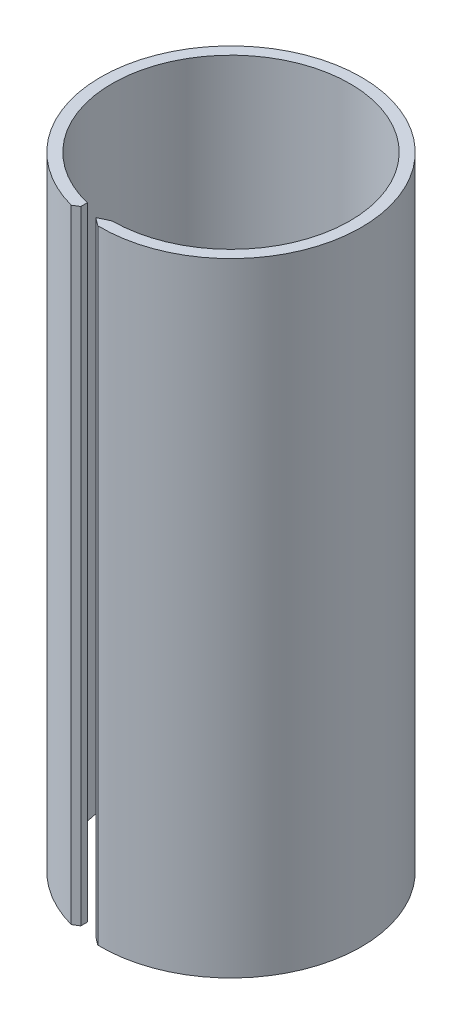
ISO-10303-21;
HEADER;
FILE_DESCRIPTION(('STEP AP214'),'2;1');
FILE_NAME('part.step','',(''),(''),'','','');
FILE_SCHEMA(('AUTOMOTIVE_DESIGN { 1 0 10303 214 1 1 1 1 }'));
ENDSEC;
DATA;
#1=APPLICATION_CONTEXT('core data for automotive mechanical design processes');
#2=APPLICATION_PROTOCOL_DEFINITION('international standard','automotive_design',2000,#1);
#3=PRODUCT_CONTEXT('',#1,'mechanical');
#4=PRODUCT('Part','Part','',(#3));
#5=PRODUCT_RELATED_PRODUCT_CATEGORY('part','',(#4));
#6=PRODUCT_DEFINITION_FORMATION('','',#4);
#7=PRODUCT_DEFINITION_CONTEXT('part definition',#1,'design');
#8=PRODUCT_DEFINITION('design','',#6,#7);
#9=PRODUCT_DEFINITION_SHAPE('','',#8);
#10=(LENGTH_UNIT() NAMED_UNIT(*) SI_UNIT(.MILLI.,.METRE.));
#11=(NAMED_UNIT(*) PLANE_ANGLE_UNIT() SI_UNIT($,.RADIAN.));
#12=(NAMED_UNIT(*) SI_UNIT($,.STERADIAN.) SOLID_ANGLE_UNIT());
#13=UNCERTAINTY_MEASURE_WITH_UNIT(LENGTH_MEASURE(1.E-05),#10,'distance_accuracy_value','');
#14=(GEOMETRIC_REPRESENTATION_CONTEXT(3) GLOBAL_UNCERTAINTY_ASSIGNED_CONTEXT((#13)) GLOBAL_UNIT_ASSIGNED_CONTEXT((#10,
#11,#12)) REPRESENTATION_CONTEXT('',''));
#15=CARTESIAN_POINT('',(0.,0.,0.));
#16=DIRECTION('',(0.,0.,1.));
#17=DIRECTION('',(1.,0.,0.));
#18=AXIS2_PLACEMENT_3D('',#15,#16,#17);
#19=CARTESIAN_POINT('',(-11.2330386189566,110.,14.934578177157));
#20=DIRECTION('',(0.601098948357001,0.,-0.799174608132733));
#21=DIRECTION('',(-0.799174608132733,0.,-0.601098948357001));
#22=AXIS2_PLACEMENT_3D('',#19,#20,#21);
#23=PLANE('',#22);
#24=DIRECTION('',(0.799174608132733,0.,0.601098948357001));
#25=VECTOR('',#24,1.);
#26=CARTESIAN_POINT('',(-11.2330386189566,0.,14.934578177157));
#27=LINE('',#26,#25);
#28=CARTESIAN_POINT('',(-1.93503191094466,0.,21.9280712100013));
#29=VERTEX_POINT('',#28);
#30=CARTESIAN_POINT('',(-0.517623396638923,0.,22.9941746105237));
#31=VERTEX_POINT('',#30);
#32=EDGE_CURVE('E118',#29,#31,#27,.T.);
#33=ORIENTED_EDGE('',*,*,#32,.T.);
#34=DIRECTION('',(0.,-1.,0.));
#35=VECTOR('',#34,1.);
#36=CARTESIAN_POINT('',(-0.517623396638923,110.,22.9941746105237));
#37=LINE('',#36,#35);
#38=CARTESIAN_POINT('',(-0.517623396638923,110.,22.9941746105237));
#39=VERTEX_POINT('',#38);
#40=EDGE_CURVE('E11',#39,#31,#37,.T.);
#41=ORIENTED_EDGE('',*,*,#40,.F.);
#42=DIRECTION('',(0.799174608132733,0.,0.601098948357001));
#43=VECTOR('',#42,1.);
#44=CARTESIAN_POINT('',(-11.2330386189566,110.,14.934578177157));
#45=LINE('',#44,#43);
#46=CARTESIAN_POINT('',(-1.93503191094466,110.,21.9280712100013));
#47=VERTEX_POINT('',#46);
#48=EDGE_CURVE('E131',#47,#39,#45,.T.);
#49=ORIENTED_EDGE('',*,*,#48,.F.);
#50=DIRECTION('',(0.,-1.,0.));
#51=VECTOR('',#50,1.);
#52=CARTESIAN_POINT('',(-1.93503191094466,110.,21.9280712100013));
#53=LINE('',#52,#51);
#54=EDGE_CURVE('E114',#47,#29,#53,.T.);
#55=ORIENTED_EDGE('',*,*,#54,.T.);
#56=EDGE_LOOP('',(#33,#41,#49,#55));
#57=FACE_BOUND('',#56,.T.);
#58=ADVANCED_FACE('F36',(#57),#23,.F.);
#59=CARTESIAN_POINT('',(0.,110.,0.));
#60=DIRECTION('',(0.,-1.,0.));
#61=DIRECTION('',(0.,0.,-1.));
#62=AXIS2_PLACEMENT_3D('',#59,#60,#61);
#63=CYLINDRICAL_SURFACE('',#62,23.);
#64=CARTESIAN_POINT('',(0.,0.,0.));
#65=DIRECTION('',(0.,1.,0.));
#66=DIRECTION('',(0.,0.,1.));
#67=AXIS2_PLACEMENT_3D('',#64,#65,#66);
#68=CIRCLE('',#67,23.);
#69=CARTESIAN_POINT('',(-6.01479470815307,0.,22.1996001004246));
#70=VERTEX_POINT('',#69);
#71=EDGE_CURVE('E121',#31,#70,#68,.T.);
#72=ORIENTED_EDGE('',*,*,#71,.T.);
#73=DIRECTION('',(0.,-1.,0.));
#74=VECTOR('',#73,1.);
#75=CARTESIAN_POINT('',(-6.01479470815307,110.,22.1996001004246));
#76=LINE('',#75,#74);
#77=CARTESIAN_POINT('',(-6.01479470815307,110.,22.1996001004246));
#78=VERTEX_POINT('',#77);
#79=EDGE_CURVE('E44',#78,#70,#76,.T.);
#80=ORIENTED_EDGE('',*,*,#79,.F.);
#81=CARTESIAN_POINT('',(0.,110.,0.));
#82=DIRECTION('',(0.,1.,0.));
#83=DIRECTION('',(0.,0.,1.));
#84=AXIS2_PLACEMENT_3D('',#81,#82,#83);
#85=CIRCLE('',#84,23.);
#86=EDGE_CURVE('E85',#39,#78,#85,.T.);
#87=ORIENTED_EDGE('',*,*,#86,.F.);
#88=ORIENTED_EDGE('',*,*,#40,.T.);
#89=EDGE_LOOP('',(#72,#80,#87,#88));
#90=FACE_BOUND('',#89,.T.);
#91=ADVANCED_FACE('F137',(#90),#63,.T.);
#92=CARTESIAN_POINT('',(8.26520913812445,110.,13.3753973063164));
#93=DIRECTION('',(0.525673997188739,0.,0.850686104670585));
#94=DIRECTION('',(0.850686104670585,0.,-0.525673997188739));
#95=AXIS2_PLACEMENT_3D('',#92,#93,#94);
#96=PLANE('',#95);
#97=DIRECTION('',(-0.850686104670585,0.,0.525673997188739));
#98=VECTOR('',#97,1.);
#99=CARTESIAN_POINT('',(8.26520913812445,0.,13.3753973063164));
#100=LINE('',#99,#98);
#101=CARTESIAN_POINT('',(-4.96678075902174,0.,21.5519890971125));
#102=VERTEX_POINT('',#101);
#103=EDGE_CURVE('E124',#102,#70,#100,.T.);
#104=ORIENTED_EDGE('',*,*,#103,.F.);
#105=DIRECTION('',(0.,-1.,0.));
#106=VECTOR('',#105,1.);
#107=CARTESIAN_POINT('',(-4.96678075902174,110.,21.5519890971125));
#108=LINE('',#107,#106);
#109=CARTESIAN_POINT('',(-4.96678075902174,110.,21.5519890971125));
#110=VERTEX_POINT('',#109);
#111=EDGE_CURVE('E104',#110,#102,#108,.T.);
#112=ORIENTED_EDGE('',*,*,#111,.F.);
#113=DIRECTION('',(-0.850686104670585,0.,0.525673997188739));
#114=VECTOR('',#113,1.);
#115=CARTESIAN_POINT('',(8.26520913812445,110.,13.3753973063164));
#116=LINE('',#115,#114);
#117=EDGE_CURVE('E110',#110,#78,#116,.T.);
#118=ORIENTED_EDGE('',*,*,#117,.T.);
#119=ORIENTED_EDGE('',*,*,#79,.T.);
#120=EDGE_LOOP('',(#104,#112,#118,#119));
#121=FACE_BOUND('',#120,.T.);
#122=ADVANCED_FACE('F136',(#121),#96,.T.);
#123=CARTESIAN_POINT('',(-4.96678075902174,110.,0.));
#124=DIRECTION('',(1.,0.,0.));
#125=DIRECTION('',(0.,0.,-1.));
#126=AXIS2_PLACEMENT_3D('',#123,#124,#125);
#127=PLANE('',#126);
#128=DIRECTION('',(0.,0.,1.));
#129=VECTOR('',#128,1.);
#130=CARTESIAN_POINT('',(-4.96678075902174,0.,0.));
#131=LINE('',#130,#129);
#132=CARTESIAN_POINT('',(-4.96678075902174,0.,20.4041929242941));
#133=VERTEX_POINT('',#132);
#134=EDGE_CURVE('E99',#133,#102,#131,.T.);
#135=ORIENTED_EDGE('',*,*,#134,.F.);
#136=DIRECTION('',(0.,-1.,0.));
#137=VECTOR('',#136,1.);
#138=CARTESIAN_POINT('',(-4.96678075902174,110.,20.4041929242941));
#139=LINE('',#138,#137);
#140=CARTESIAN_POINT('',(-4.96678075902174,110.,20.4041929242941));
#141=VERTEX_POINT('',#140);
#142=EDGE_CURVE('E94',#141,#133,#139,.T.);
#143=ORIENTED_EDGE('',*,*,#142,.F.);
#144=DIRECTION('',(0.,0.,1.));
#145=VECTOR('',#144,1.);
#146=CARTESIAN_POINT('',(-4.96678075902174,110.,0.));
#147=LINE('',#146,#145);
#148=EDGE_CURVE('E97',#141,#110,#147,.T.);
#149=ORIENTED_EDGE('',*,*,#148,.T.);
#150=ORIENTED_EDGE('',*,*,#111,.T.);
#151=EDGE_LOOP('',(#135,#143,#149,#150));
#152=FACE_BOUND('',#151,.T.);
#153=ADVANCED_FACE('F96',(#152),#127,.T.);
#154=CARTESIAN_POINT('',(0.,110.,0.));
#155=DIRECTION('',(0.,-1.,0.));
#156=DIRECTION('',(0.,0.,-1.));
#157=AXIS2_PLACEMENT_3D('',#154,#155,#156);
#158=CYLINDRICAL_SURFACE('',#157,21.);
#159=CARTESIAN_POINT('',(0.,0.,0.));
#160=DIRECTION('',(0.,1.,0.));
#161=DIRECTION('',(0.,0.,1.));
#162=AXIS2_PLACEMENT_3D('',#159,#160,#161);
#163=CIRCLE('',#162,21.);
#164=CARTESIAN_POINT('',(0.,0.,21.));
#165=VERTEX_POINT('',#164);
#166=EDGE_CURVE('E128',#165,#133,#163,.T.);
#167=ORIENTED_EDGE('',*,*,#166,.F.);
#168=DIRECTION('',(0.,-1.,0.));
#169=VECTOR('',#168,1.);
#170=CARTESIAN_POINT('',(0.,110.,21.));
#171=LINE('',#170,#169);
#172=CARTESIAN_POINT('',(0.,110.,21.));
#173=VERTEX_POINT('',#172);
#174=EDGE_CURVE('E74',#173,#165,#171,.T.);
#175=ORIENTED_EDGE('',*,*,#174,.F.);
#176=CARTESIAN_POINT('',(0.,110.,0.));
#177=DIRECTION('',(0.,1.,0.));
#178=DIRECTION('',(0.,0.,1.));
#179=AXIS2_PLACEMENT_3D('',#176,#177,#178);
#180=CIRCLE('',#179,21.);
#181=EDGE_CURVE('E108',#173,#141,#180,.T.);
#182=ORIENTED_EDGE('',*,*,#181,.T.);
#183=ORIENTED_EDGE('',*,*,#142,.T.);
#184=EDGE_LOOP('',(#167,#175,#182,#183));
#185=FACE_BOUND('',#184,.T.);
#186=ADVANCED_FACE('F112',(#185),#158,.F.);
#187=CARTESIAN_POINT('',(8.18835027550521,110.,17.072740658632));
#188=DIRECTION('',(0.432449245101612,0.,0.901658278069384));
#189=DIRECTION('',(0.901658278069384,0.,-0.432449245101612));
#190=AXIS2_PLACEMENT_3D('',#187,#188,#189);
#191=PLANE('',#190);
#192=DIRECTION('',(-0.901658278069384,0.,0.432449245101612));
#193=VECTOR('',#192,1.);
#194=CARTESIAN_POINT('',(8.18835027550521,0.,17.072740658632));
#195=LINE('',#194,#193);
#196=EDGE_CURVE('E77',#165,#29,#195,.T.);
#197=ORIENTED_EDGE('',*,*,#196,.T.);
#198=ORIENTED_EDGE('',*,*,#54,.F.);
#199=DIRECTION('',(-0.901658278069384,0.,0.432449245101612));
#200=VECTOR('',#199,1.);
#201=CARTESIAN_POINT('',(8.18835027550521,110.,17.072740658632));
#202=LINE('',#201,#200);
#203=EDGE_CURVE('E52',#173,#47,#202,.T.);
#204=ORIENTED_EDGE('',*,*,#203,.F.);
#205=ORIENTED_EDGE('',*,*,#174,.T.);
#206=EDGE_LOOP('',(#197,#198,#204,#205));
#207=FACE_BOUND('',#206,.T.);
#208=ADVANCED_FACE('F144',(#207),#191,.F.);
#209=CARTESIAN_POINT('',(0.,110.,0.));
#210=DIRECTION('',(0.,1.,0.));
#211=DIRECTION('',(0.,0.,1.));
#212=AXIS2_PLACEMENT_3D('',#209,#210,#211);
#213=PLANE('',#212);
#214=ORIENTED_EDGE('',*,*,#48,.T.);
#215=ORIENTED_EDGE('',*,*,#86,.T.);
#216=ORIENTED_EDGE('',*,*,#117,.F.);
#217=ORIENTED_EDGE('',*,*,#148,.F.);
#218=ORIENTED_EDGE('',*,*,#181,.F.);
#219=ORIENTED_EDGE('',*,*,#203,.T.);
#220=EDGE_LOOP('',(#214,#215,#216,#217,#218,#219));
#221=FACE_BOUND('',#220,.T.);
#222=ADVANCED_FACE('F107',(#221),#213,.T.);
#223=CARTESIAN_POINT('',(0.,0.,0.));
#224=DIRECTION('',(0.,1.,0.));
#225=DIRECTION('',(0.,0.,1.));
#226=AXIS2_PLACEMENT_3D('',#223,#224,#225);
#227=PLANE('',#226);
#228=ORIENTED_EDGE('',*,*,#32,.F.);
#229=ORIENTED_EDGE('',*,*,#196,.F.);
#230=ORIENTED_EDGE('',*,*,#166,.T.);
#231=ORIENTED_EDGE('',*,*,#134,.T.);
#232=ORIENTED_EDGE('',*,*,#103,.T.);
#233=ORIENTED_EDGE('',*,*,#71,.F.);
#234=EDGE_LOOP('',(#228,#229,#230,#231,#232,#233));
#235=FACE_BOUND('',#234,.T.);
#236=ADVANCED_FACE('F141',(#235),#227,.F.);
#237=CLOSED_SHELL('',(#58,#91,#122,#153,#186,#208,#222,#236));
#238=MANIFOLD_SOLID_BREP('B2',#237);
#239=ADVANCED_BREP_SHAPE_REPRESENTATION('',(#18,#238),#14);
#240=SHAPE_DEFINITION_REPRESENTATION(#9,#239);
ENDSEC;
END-ISO-10303-21;
